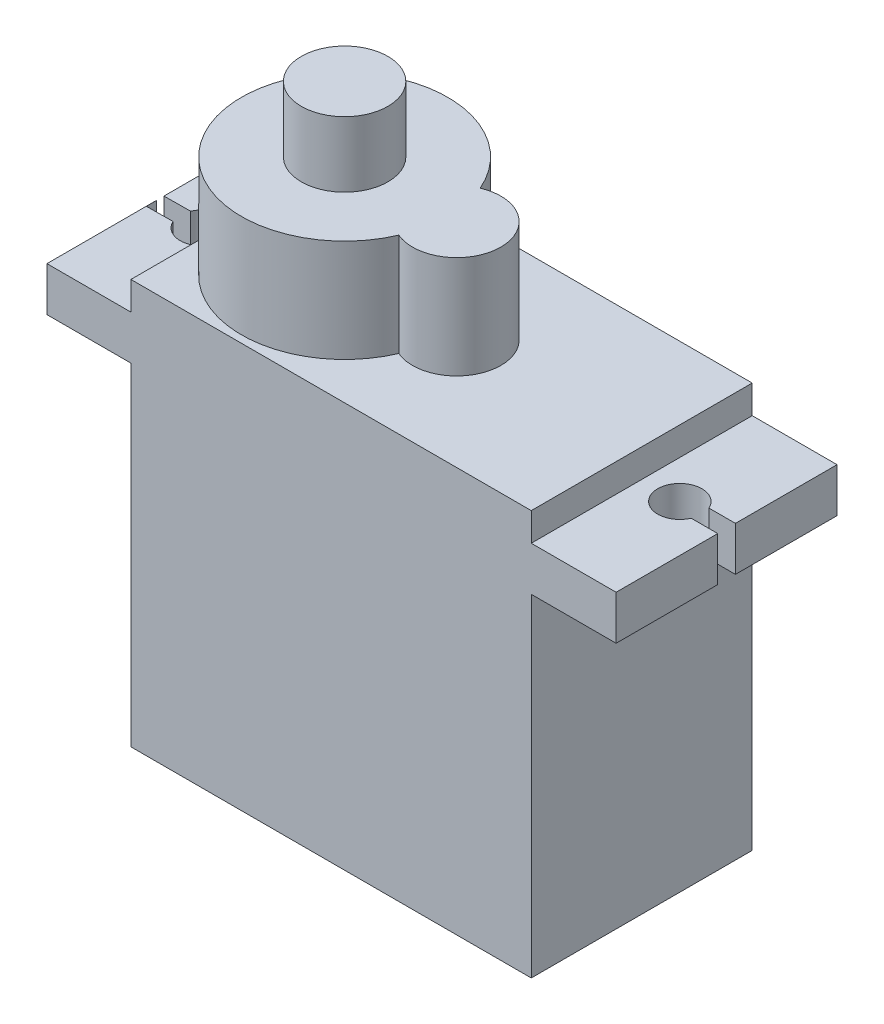
ISO-10303-21;
HEADER;
FILE_DESCRIPTION(('STEP AP214'),'2;1');
FILE_NAME('part.step','',(''),(''),'','','');
FILE_SCHEMA(('AUTOMOTIVE_DESIGN { 1 0 10303 214 1 1 1 1 }'));
ENDSEC;
DATA;
#1=APPLICATION_CONTEXT('core data for automotive mechanical design processes');
#2=APPLICATION_PROTOCOL_DEFINITION('international standard','automotive_design',2000,#1);
#3=PRODUCT_CONTEXT('',#1,'mechanical');
#4=PRODUCT('Part','Part','',(#3));
#5=PRODUCT_RELATED_PRODUCT_CATEGORY('part','',(#4));
#6=PRODUCT_DEFINITION_FORMATION('','',#4);
#7=PRODUCT_DEFINITION_CONTEXT('part definition',#1,'design');
#8=PRODUCT_DEFINITION('design','',#6,#7);
#9=PRODUCT_DEFINITION_SHAPE('','',#8);
#10=(LENGTH_UNIT() NAMED_UNIT(*) SI_UNIT(.MILLI.,.METRE.));
#11=(NAMED_UNIT(*) PLANE_ANGLE_UNIT() SI_UNIT($,.RADIAN.));
#12=(NAMED_UNIT(*) SI_UNIT($,.STERADIAN.) SOLID_ANGLE_UNIT());
#13=UNCERTAINTY_MEASURE_WITH_UNIT(LENGTH_MEASURE(1.E-05),#10,'distance_accuracy_value','');
#14=(GEOMETRIC_REPRESENTATION_CONTEXT(3) GLOBAL_UNCERTAINTY_ASSIGNED_CONTEXT((#13)) GLOBAL_UNIT_ASSIGNED_CONTEXT((#10,
#11,#12)) REPRESENTATION_CONTEXT('',''));
#15=CARTESIAN_POINT('',(0.,0.,0.));
#16=DIRECTION('',(0.,0.,1.));
#17=DIRECTION('',(1.,0.,0.));
#18=AXIS2_PLACEMENT_3D('',#15,#16,#17);
#19=CARTESIAN_POINT('',(-47.695532413833,5.15,2.20686180578577));
#20=DIRECTION('',(1.,0.,0.));
#21=DIRECTION('',(0.,0.,-1.));
#22=AXIS2_PLACEMENT_3D('',#19,#20,#21);
#23=CYLINDRICAL_SURFACE('',#22,0.6);
#24=CARTESIAN_POINT('',(-47.695532413833,5.15,2.20686180578577));
#25=DIRECTION('',(-1.,0.,0.));
#26=DIRECTION('',(0.,0.,1.));
#27=AXIS2_PLACEMENT_3D('',#24,#25,#26);
#28=CIRCLE('',#27,0.6);
#29=CARTESIAN_POINT('',(-47.695532413833,5.15,2.80686180578577));
#30=VERTEX_POINT('',#29);
#31=EDGE_CURVE('E12',#30,#30,#28,.T.);
#32=ORIENTED_EDGE('',*,*,#31,.F.);
#33=EDGE_LOOP('',(#32));
#34=FACE_BOUND('',#33,.T.);
#35=CARTESIAN_POINT('',(-46.195532413833,5.15,2.20686180578577));
#36=DIRECTION('',(-1.,0.,0.));
#37=DIRECTION('',(0.,0.,1.));
#38=AXIS2_PLACEMENT_3D('',#35,#36,#37);
#39=CIRCLE('',#38,0.6);
#40=CARTESIAN_POINT('',(-46.195532413833,5.15,2.80686180578577));
#41=VERTEX_POINT('',#40);
#42=EDGE_CURVE('E55',#41,#41,#39,.T.);
#43=ORIENTED_EDGE('',*,*,#42,.T.);
#44=EDGE_LOOP('',(#43));
#45=FACE_BOUND('',#44,.T.);
#46=ADVANCED_FACE('F52',(#34,#45),#23,.T.);
#47=CARTESIAN_POINT('',(-47.695532413833,0.,0.));
#48=DIRECTION('',(-1.,0.,0.));
#49=DIRECTION('',(0.,0.,1.));
#50=AXIS2_PLACEMENT_3D('',#47,#48,#49);
#51=PLANE('',#50);
#52=ORIENTED_EDGE('',*,*,#31,.T.);
#53=EDGE_LOOP('',(#52));
#54=FACE_BOUND('',#53,.T.);
#55=ADVANCED_FACE('F67',(#54),#51,.T.);
#56=CARTESIAN_POINT('',(-46.195532413833,0.,0.));
#57=DIRECTION('',(-1.,0.,0.));
#58=DIRECTION('',(0.,0.,1.));
#59=AXIS2_PLACEMENT_3D('',#56,#57,#58);
#60=PLANE('',#59);
#61=ORIENTED_EDGE('',*,*,#42,.F.);
#62=EDGE_LOOP('',(#61));
#63=FACE_BOUND('',#62,.T.);
#64=ADVANCED_FACE('F65',(#63),#60,.F.);
#65=CLOSED_SHELL('',(#46,#55,#64));
#66=MANIFOLD_SOLID_BREP('B2',#65);
#67=CARTESIAN_POINT('',(-47.695532413833,5.15,1.00686180578577));
#68=DIRECTION('',(1.,0.,0.));
#69=DIRECTION('',(0.,0.,-1.));
#70=AXIS2_PLACEMENT_3D('',#67,#68,#69);
#71=CYLINDRICAL_SURFACE('',#70,0.6);
#72=CARTESIAN_POINT('',(-47.695532413833,5.15,1.00686180578577));
#73=DIRECTION('',(-1.,0.,0.));
#74=DIRECTION('',(0.,0.,1.));
#75=AXIS2_PLACEMENT_3D('',#72,#73,#74);
#76=CIRCLE('',#75,0.6);
#77=CARTESIAN_POINT('',(-47.695532413833,5.15,1.60686180578577));
#78=VERTEX_POINT('',#77);
#79=EDGE_CURVE('E51',#78,#78,#76,.T.);
#80=ORIENTED_EDGE('',*,*,#79,.F.);
#81=EDGE_LOOP('',(#80));
#82=FACE_BOUND('',#81,.T.);
#83=CARTESIAN_POINT('',(-46.195532413833,5.15,1.00686180578577));
#84=DIRECTION('',(-1.,0.,0.));
#85=DIRECTION('',(0.,0.,1.));
#86=AXIS2_PLACEMENT_3D('',#83,#84,#85);
#87=CIRCLE('',#86,0.6);
#88=CARTESIAN_POINT('',(-46.195532413833,5.15,1.60686180578577));
#89=VERTEX_POINT('',#88);
#90=EDGE_CURVE('E114',#89,#89,#87,.T.);
#91=ORIENTED_EDGE('',*,*,#90,.T.);
#92=EDGE_LOOP('',(#91));
#93=FACE_BOUND('',#92,.T.);
#94=ADVANCED_FACE('F111',(#82,#93),#71,.T.);
#95=CARTESIAN_POINT('',(-47.695532413833,0.,0.));
#96=DIRECTION('',(-1.,0.,0.));
#97=DIRECTION('',(0.,0.,1.));
#98=AXIS2_PLACEMENT_3D('',#95,#96,#97);
#99=PLANE('',#98);
#100=ORIENTED_EDGE('',*,*,#79,.T.);
#101=EDGE_LOOP('',(#100));
#102=FACE_BOUND('',#101,.T.);
#103=ADVANCED_FACE('F126',(#102),#99,.T.);
#104=CARTESIAN_POINT('',(-46.195532413833,0.,0.));
#105=DIRECTION('',(-1.,0.,0.));
#106=DIRECTION('',(0.,0.,1.));
#107=AXIS2_PLACEMENT_3D('',#104,#105,#106);
#108=PLANE('',#107);
#109=ORIENTED_EDGE('',*,*,#90,.F.);
#110=EDGE_LOOP('',(#109));
#111=FACE_BOUND('',#110,.T.);
#112=ADVANCED_FACE('F124',(#111),#108,.F.);
#113=CLOSED_SHELL('',(#94,#103,#112));
#114=MANIFOLD_SOLID_BREP('B7',#113);
#115=CARTESIAN_POINT('',(-47.695532413833,5.15,-0.193138194214225));
#116=DIRECTION('',(1.,0.,0.));
#117=DIRECTION('',(0.,0.,-1.));
#118=AXIS2_PLACEMENT_3D('',#115,#116,#117);
#119=CYLINDRICAL_SURFACE('',#118,0.6);
#120=CARTESIAN_POINT('',(-47.695532413833,5.15,-0.193138194214225));
#121=DIRECTION('',(-1.,0.,0.));
#122=DIRECTION('',(0.,0.,1.));
#123=AXIS2_PLACEMENT_3D('',#120,#121,#122);
#124=CIRCLE('',#123,0.6);
#125=CARTESIAN_POINT('',(-47.695532413833,5.15,0.406861805785774));
#126=VERTEX_POINT('',#125);
#127=EDGE_CURVE('E110',#126,#126,#124,.T.);
#128=ORIENTED_EDGE('',*,*,#127,.F.);
#129=EDGE_LOOP('',(#128));
#130=FACE_BOUND('',#129,.T.);
#131=CARTESIAN_POINT('',(-46.195532413833,5.15,-0.193138194214225));
#132=DIRECTION('',(-1.,0.,0.));
#133=DIRECTION('',(0.,0.,1.));
#134=AXIS2_PLACEMENT_3D('',#131,#132,#133);
#135=CIRCLE('',#134,0.6);
#136=CARTESIAN_POINT('',(-46.195532413833,5.15,0.406861805785774));
#137=VERTEX_POINT('',#136);
#138=EDGE_CURVE('E174',#137,#137,#135,.T.);
#139=ORIENTED_EDGE('',*,*,#138,.T.);
#140=EDGE_LOOP('',(#139));
#141=FACE_BOUND('',#140,.T.);
#142=ADVANCED_FACE('F171',(#130,#141),#119,.T.);
#143=CARTESIAN_POINT('',(-47.695532413833,0.,0.));
#144=DIRECTION('',(-1.,0.,0.));
#145=DIRECTION('',(0.,0.,1.));
#146=AXIS2_PLACEMENT_3D('',#143,#144,#145);
#147=PLANE('',#146);
#148=ORIENTED_EDGE('',*,*,#127,.T.);
#149=EDGE_LOOP('',(#148));
#150=FACE_BOUND('',#149,.T.);
#151=ADVANCED_FACE('F186',(#150),#147,.T.);
#152=CARTESIAN_POINT('',(-46.195532413833,0.,0.));
#153=DIRECTION('',(-1.,0.,0.));
#154=DIRECTION('',(0.,0.,1.));
#155=AXIS2_PLACEMENT_3D('',#152,#153,#154);
#156=PLANE('',#155);
#157=ORIENTED_EDGE('',*,*,#138,.F.);
#158=EDGE_LOOP('',(#157));
#159=FACE_BOUND('',#158,.T.);
#160=ADVANCED_FACE('F184',(#159),#156,.F.);
#161=CLOSED_SHELL('',(#142,#151,#160));
#162=MANIFOLD_SOLID_BREP('B46',#161);
#163=CARTESIAN_POINT('',(-50.945532413833,21.3,7.25686180578577));
#164=DIRECTION('',(0.,1.,0.));
#165=DIRECTION('',(0.,0.,1.));
#166=AXIS2_PLACEMENT_3D('',#163,#164,#165);
#167=PLANE('',#166);
#168=DIRECTION('',(-0.999968000511992,0.,0.00799987200204793));
#169=VECTOR('',#168,1.);
#170=CARTESIAN_POINT('',(-50.990499710868,21.3,1.63603961100693));
#171=LINE('',#170,#169);
#172=CARTESIAN_POINT('',(-49.4410652853071,21.3,1.62364393727167));
#173=VERTEX_POINT('',#172);
#174=CARTESIAN_POINT('',(-50.9410172860751,21.3,1.63564374527474));
#175=VERTEX_POINT('',#174);
#176=EDGE_CURVE('E389',#173,#175,#171,.T.);
#177=ORIENTED_EDGE('',*,*,#176,.T.);
#178=DIRECTION('',(-0.00799987200204854,0.,-0.999968000511992));
#179=VECTOR('',#178,1.);
#180=CARTESIAN_POINT('',(-50.8960499890401,21.3,7.25646594005358));
#181=LINE('',#180,#179);
#182=CARTESIAN_POINT('',(-50.945532413833,21.3,1.07126180578696));
#183=VERTEX_POINT('',#182);
#184=EDGE_CURVE('E413',#175,#183,#181,.T.);
#185=ORIENTED_EDGE('',*,*,#184,.T.);
#186=DIRECTION('',(0.,0.,1.));
#187=VECTOR('',#186,1.);
#188=CARTESIAN_POINT('',(-50.945532413833,21.3,7.25686180578577));
#189=LINE('',#188,#187);
#190=CARTESIAN_POINT('',(-50.945532413833,21.3,7.25686180578577));
#191=VERTEX_POINT('',#190);
#192=EDGE_CURVE('E460',#183,#191,#189,.T.);
#193=ORIENTED_EDGE('',*,*,#192,.T.);
#194=DIRECTION('',(1.,0.,0.));
#195=VECTOR('',#194,1.);
#196=CARTESIAN_POINT('',(-50.945532413833,21.3,7.25686180578577));
#197=LINE('',#196,#195);
#198=CARTESIAN_POINT('',(-46.195532413833,21.3,7.25686180578577));
#199=VERTEX_POINT('',#198);
#200=EDGE_CURVE('E465',#191,#199,#197,.T.);
#201=ORIENTED_EDGE('',*,*,#200,.T.);
#202=DIRECTION('',(0.,0.,1.));
#203=VECTOR('',#202,1.);
#204=CARTESIAN_POINT('',(-46.195532413833,21.3,-5.24313819421423));
#205=LINE('',#204,#203);
#206=CARTESIAN_POINT('',(-46.195532413833,21.3,-5.24313819421423));
#207=VERTEX_POINT('',#206);
#208=EDGE_CURVE('E487',#207,#199,#205,.T.);
#209=ORIENTED_EDGE('',*,*,#208,.F.);
#210=DIRECTION('',(1.,0.,0.));
#211=VECTOR('',#210,1.);
#212=CARTESIAN_POINT('',(-50.945532413833,21.3,-5.24313819421423));
#213=LINE('',#212,#211);
#214=CARTESIAN_POINT('',(-50.945532413833,21.3,-5.24313819421423));
#215=VERTEX_POINT('',#214);
#216=EDGE_CURVE('E469',#215,#207,#213,.T.);
#217=ORIENTED_EDGE('',*,*,#216,.F.);
#218=CARTESIAN_POINT('',(-50.945532413833,21.3,0.635647866362738));
#219=VERTEX_POINT('',#218);
#220=EDGE_CURVE('E461',#215,#219,#189,.T.);
#221=ORIENTED_EDGE('',*,*,#220,.T.);
#222=DIRECTION('',(0.999968000511992,0.,-0.00799987200204735));
#223=VECTOR('',#222,1.);
#224=CARTESIAN_POINT('',(-50.99849958287,21.3,0.63607161049494));
#225=LINE('',#224,#223);
#226=CARTESIAN_POINT('',(-49.4490651573091,21.3,0.623675936759674));
#227=VERTEX_POINT('',#226);
#228=EDGE_CURVE('E237',#219,#227,#225,.T.);
#229=ORIENTED_EDGE('',*,*,#228,.T.);
#230=CARTESIAN_POINT('',(-48.2994579575881,21.3,1.11449493226583));
#231=DIRECTION('',(0.,1.,0.));
#232=DIRECTION('',(0.,0.,1.));
#233=AXIS2_PLACEMENT_3D('',#230,#231,#232);
#234=CIRCLE('',#233,1.25);
#235=EDGE_CURVE('E417',#227,#173,#234,.F.);
#236=ORIENTED_EDGE('',*,*,#235,.T.);
#237=EDGE_LOOP('',(#177,#185,#193,#201,#209,#217,#221,#229,#236));
#238=FACE_BOUND('',#237,.T.);
#239=ADVANCED_FACE('F222',(#238),#167,.T.);
#240=CARTESIAN_POINT('',(-50.945532413833,18.8,7.25686180578577));
#241=DIRECTION('',(0.,-1.,0.));
#242=DIRECTION('',(0.,0.,-1.));
#243=AXIS2_PLACEMENT_3D('',#240,#241,#242);
#244=PLANE('',#243);
#245=DIRECTION('',(0.,0.,-1.));
#246=VECTOR('',#245,1.);
#247=CARTESIAN_POINT('',(-50.945532413833,18.8,7.25686180578577));
#248=LINE('',#247,#246);
#249=CARTESIAN_POINT('',(-50.945532413833,18.8,7.25686180578577));
#250=VERTEX_POINT('',#249);
#251=CARTESIAN_POINT('',(-50.945532413833,18.8,1.07126180578678));
#252=VERTEX_POINT('',#251);
#253=EDGE_CURVE('E455',#250,#252,#248,.T.);
#254=ORIENTED_EDGE('',*,*,#253,.T.);
#255=DIRECTION('',(-0.00799987200204854,0.,-0.999968000511992));
#256=VECTOR('',#255,1.);
#257=CARTESIAN_POINT('',(-50.9490171580771,18.8,0.635675744762745));
#258=LINE('',#257,#256);
#259=CARTESIAN_POINT('',(-50.9410172860751,18.8,1.63564374527474));
#260=VERTEX_POINT('',#259);
#261=EDGE_CURVE('E404',#260,#252,#258,.T.);
#262=ORIENTED_EDGE('',*,*,#261,.F.);
#263=DIRECTION('',(-0.999968000511992,0.,0.00799987200204793));
#264=VECTOR('',#263,1.);
#265=CARTESIAN_POINT('',(-50.9410172860751,18.8,1.63564374527474));
#266=LINE('',#265,#264);
#267=CARTESIAN_POINT('',(-49.4410652853071,18.8,1.62364393727167));
#268=VERTEX_POINT('',#267);
#269=EDGE_CURVE('E386',#268,#260,#266,.T.);
#270=ORIENTED_EDGE('',*,*,#269,.F.);
#271=CARTESIAN_POINT('',(-48.2994579575881,18.8,1.11449493226583));
#272=DIRECTION('',(0.,-1.,0.));
#273=DIRECTION('',(0.,0.,-1.));
#274=AXIS2_PLACEMENT_3D('',#271,#272,#273);
#275=CIRCLE('',#274,1.25);
#276=CARTESIAN_POINT('',(-49.4490651573091,18.8,0.623675936759674));
#277=VERTEX_POINT('',#276);
#278=EDGE_CURVE('E396',#277,#268,#275,.T.);
#279=ORIENTED_EDGE('',*,*,#278,.F.);
#280=DIRECTION('',(0.999968000511992,0.,-0.00799987200204735));
#281=VECTOR('',#280,1.);
#282=CARTESIAN_POINT('',(-50.9490171580771,18.8,0.635675744762745));
#283=LINE('',#282,#281);
#284=CARTESIAN_POINT('',(-50.945532413833,18.8,0.635647866362738));
#285=VERTEX_POINT('',#284);
#286=EDGE_CURVE('E400',#285,#277,#283,.T.);
#287=ORIENTED_EDGE('',*,*,#286,.F.);
#288=CARTESIAN_POINT('',(-50.945532413833,18.8,-5.24313819421423));
#289=VERTEX_POINT('',#288);
#290=EDGE_CURVE('E454',#285,#289,#248,.T.);
#291=ORIENTED_EDGE('',*,*,#290,.T.);
#292=DIRECTION('',(1.,0.,0.));
#293=VECTOR('',#292,1.);
#294=CARTESIAN_POINT('',(-50.945532413833,18.8,-5.24313819421423));
#295=LINE('',#294,#293);
#296=CARTESIAN_POINT('',(-46.195532413833,18.8,-5.24313819421423));
#297=VERTEX_POINT('',#296);
#298=EDGE_CURVE('E473',#289,#297,#295,.T.);
#299=ORIENTED_EDGE('',*,*,#298,.T.);
#300=DIRECTION('',(0.,0.,-1.));
#301=VECTOR('',#300,1.);
#302=CARTESIAN_POINT('',(-46.195532413833,18.8,-5.24313819421423));
#303=LINE('',#302,#301);
#304=CARTESIAN_POINT('',(-46.195532413833,18.8,7.25686180578577));
#305=VERTEX_POINT('',#304);
#306=EDGE_CURVE('E481',#305,#297,#303,.T.);
#307=ORIENTED_EDGE('',*,*,#306,.F.);
#308=DIRECTION('',(1.,0.,0.));
#309=VECTOR('',#308,1.);
#310=CARTESIAN_POINT('',(-50.945532413833,18.8,7.25686180578577));
#311=LINE('',#310,#309);
#312=EDGE_CURVE('E476',#250,#305,#311,.T.);
#313=ORIENTED_EDGE('',*,*,#312,.F.);
#314=EDGE_LOOP('',(#254,#262,#270,#279,#287,#291,#299,#307,#313));
#315=FACE_BOUND('',#314,.T.);
#316=ADVANCED_FACE('F403',(#315),#244,.T.);
#317=CARTESIAN_POINT('',(-50.945532413833,0.,0.));
#318=DIRECTION('',(-1.,0.,0.));
#319=DIRECTION('',(0.,0.,1.));
#320=AXIS2_PLACEMENT_3D('',#317,#318,#319);
#321=PLANE('',#320);
#322=ORIENTED_EDGE('',*,*,#192,.F.);
#323=DIRECTION('',(0.,-1.,0.));
#324=VECTOR('',#323,1.);
#325=CARTESIAN_POINT('',(-50.945532413833,0.,1.07126180578696));
#326=LINE('',#325,#324);
#327=EDGE_CURVE('E169',#183,#252,#326,.T.);
#328=ORIENTED_EDGE('',*,*,#327,.T.);
#329=ORIENTED_EDGE('',*,*,#253,.F.);
#330=DIRECTION('',(0.,-1.,0.));
#331=VECTOR('',#330,1.);
#332=CARTESIAN_POINT('',(-50.945532413833,18.8,7.25686180578577));
#333=LINE('',#332,#331);
#334=EDGE_CURVE('E451',#191,#250,#333,.T.);
#335=ORIENTED_EDGE('',*,*,#334,.F.);
#336=EDGE_LOOP('',(#322,#328,#329,#335));
#337=FACE_BOUND('',#336,.T.);
#338=ADVANCED_FACE('F643',(#337),#321,.T.);
#339=ORIENTED_EDGE('',*,*,#290,.F.);
#340=DIRECTION('',(0.,1.,0.));
#341=VECTOR('',#340,1.);
#342=CARTESIAN_POINT('',(-50.945532413833,0.,0.635647866362738));
#343=LINE('',#342,#341);
#344=EDGE_CURVE('E230',#285,#219,#343,.T.);
#345=ORIENTED_EDGE('',*,*,#344,.T.);
#346=ORIENTED_EDGE('',*,*,#220,.F.);
#347=DIRECTION('',(0.,1.,0.));
#348=VECTOR('',#347,1.);
#349=CARTESIAN_POINT('',(-50.945532413833,18.8,-5.24313819421423));
#350=LINE('',#349,#348);
#351=EDGE_CURVE('E457',#289,#215,#350,.T.);
#352=ORIENTED_EDGE('',*,*,#351,.F.);
#353=EDGE_LOOP('',(#339,#345,#346,#352));
#354=FACE_BOUND('',#353,.T.);
#355=ADVANCED_FACE('F561',(#354),#321,.T.);
#356=CARTESIAN_POINT('',(-18.745532413833,0.,0.));
#357=DIRECTION('',(-1.,0.,0.));
#358=DIRECTION('',(0.,0.,1.));
#359=AXIS2_PLACEMENT_3D('',#356,#357,#358);
#360=PLANE('',#359);
#361=DIRECTION('',(0.,1.,0.));
#362=VECTOR('',#361,1.);
#363=CARTESIAN_POINT('',(-18.745532413833,14.1678771650443,1.50686180578577));
#364=LINE('',#363,#362);
#365=CARTESIAN_POINT('',(-18.745532413833,18.8,1.50686180578577));
#366=VERTEX_POINT('',#365);
#367=CARTESIAN_POINT('',(-18.745532413833,21.3,1.50686180578577));
#368=VERTEX_POINT('',#367);
#369=EDGE_CURVE('E429',#366,#368,#364,.T.);
#370=ORIENTED_EDGE('',*,*,#369,.T.);
#371=DIRECTION('',(0.,0.,1.));
#372=VECTOR('',#371,1.);
#373=CARTESIAN_POINT('',(-18.745532413833,21.3,7.25686180578577));
#374=LINE('',#373,#372);
#375=CARTESIAN_POINT('',(-18.745532413833,21.3,7.25686180578577));
#376=VERTEX_POINT('',#375);
#377=EDGE_CURVE('E447',#368,#376,#374,.T.);
#378=ORIENTED_EDGE('',*,*,#377,.T.);
#379=DIRECTION('',(0.,-1.,0.));
#380=VECTOR('',#379,1.);
#381=CARTESIAN_POINT('',(-18.745532413833,18.8,7.25686180578577));
#382=LINE('',#381,#380);
#383=CARTESIAN_POINT('',(-18.745532413833,18.8,7.25686180578577));
#384=VERTEX_POINT('',#383);
#385=EDGE_CURVE('E422',#376,#384,#382,.T.);
#386=ORIENTED_EDGE('',*,*,#385,.T.);
#387=DIRECTION('',(0.,0.,-1.));
#388=VECTOR('',#387,1.);
#389=CARTESIAN_POINT('',(-18.745532413833,18.8,7.25686180578577));
#390=LINE('',#389,#388);
#391=EDGE_CURVE('E441',#384,#366,#390,.T.);
#392=ORIENTED_EDGE('',*,*,#391,.T.);
#393=EDGE_LOOP('',(#370,#378,#386,#392));
#394=FACE_BOUND('',#393,.T.);
#395=ADVANCED_FACE('F591',(#394),#360,.F.);
#396=DIRECTION('',(0.,1.,0.));
#397=VECTOR('',#396,1.);
#398=CARTESIAN_POINT('',(-18.745532413833,14.1678771650443,0.506861805785774));
#399=LINE('',#398,#397);
#400=CARTESIAN_POINT('',(-18.745532413833,18.8,0.506861805785774));
#401=VERTEX_POINT('',#400);
#402=CARTESIAN_POINT('',(-18.745532413833,21.3,0.506861805785774));
#403=VERTEX_POINT('',#402);
#404=EDGE_CURVE('E245',#401,#403,#399,.T.);
#405=ORIENTED_EDGE('',*,*,#404,.F.);
#406=CARTESIAN_POINT('',(-18.745532413833,18.8,-5.24313819421423));
#407=VERTEX_POINT('',#406);
#408=EDGE_CURVE('E440',#401,#407,#390,.T.);
#409=ORIENTED_EDGE('',*,*,#408,.T.);
#410=DIRECTION('',(0.,1.,0.));
#411=VECTOR('',#410,1.);
#412=CARTESIAN_POINT('',(-18.745532413833,18.8,-5.24313819421423));
#413=LINE('',#412,#411);
#414=CARTESIAN_POINT('',(-18.745532413833,21.3,-5.24313819421423));
#415=VERTEX_POINT('',#414);
#416=EDGE_CURVE('E444',#407,#415,#413,.T.);
#417=ORIENTED_EDGE('',*,*,#416,.T.);
#418=EDGE_CURVE('E448',#415,#403,#374,.T.);
#419=ORIENTED_EDGE('',*,*,#418,.T.);
#420=EDGE_LOOP('',(#405,#409,#417,#419));
#421=FACE_BOUND('',#420,.T.);
#422=ADVANCED_FACE('F617',(#421),#360,.F.);
#423=CARTESIAN_POINT('',(-21.391176337572,18.8,1.00686180578577));
#424=DIRECTION('',(0.,-1.,0.));
#425=DIRECTION('',(0.,0.,-1.));
#426=AXIS2_PLACEMENT_3D('',#423,#424,#425);
#427=CIRCLE('',#426,1.25);
#428=CARTESIAN_POINT('',(-20.245532413833,18.8,1.50686180578577));
#429=VERTEX_POINT('',#428);
#430=CARTESIAN_POINT('',(-20.245532413833,18.8,0.506861805785775));
#431=VERTEX_POINT('',#430);
#432=EDGE_CURVE('E419',#429,#431,#427,.T.);
#433=ORIENTED_EDGE('',*,*,#432,.F.);
#434=DIRECTION('',(-1.,0.,0.));
#435=VECTOR('',#434,1.);
#436=CARTESIAN_POINT('',(-18.745532413833,18.8,1.50686180578577));
#437=LINE('',#436,#435);
#438=EDGE_CURVE('E423',#366,#429,#437,.T.);
#439=ORIENTED_EDGE('',*,*,#438,.F.);
#440=ORIENTED_EDGE('',*,*,#391,.F.);
#441=CARTESIAN_POINT('',(-23.545532413833,18.8,7.25686180578577));
#442=VERTEX_POINT('',#441);
#443=EDGE_CURVE('E464',#442,#384,#311,.T.);
#444=ORIENTED_EDGE('',*,*,#443,.F.);
#445=DIRECTION('',(0.,0.,1.));
#446=VECTOR('',#445,1.);
#447=CARTESIAN_POINT('',(-23.545532413833,18.8,-5.24313819421423));
#448=LINE('',#447,#446);
#449=CARTESIAN_POINT('',(-23.545532413833,18.8,-5.24313819421423));
#450=VERTEX_POINT('',#449);
#451=EDGE_CURVE('E467',#450,#442,#448,.T.);
#452=ORIENTED_EDGE('',*,*,#451,.F.);
#453=EDGE_CURVE('E475',#450,#407,#295,.T.);
#454=ORIENTED_EDGE('',*,*,#453,.T.);
#455=ORIENTED_EDGE('',*,*,#408,.F.);
#456=DIRECTION('',(1.,0.,0.));
#457=VECTOR('',#456,1.);
#458=CARTESIAN_POINT('',(-18.745532413833,18.8,0.506861805785774));
#459=LINE('',#458,#457);
#460=EDGE_CURVE('E426',#431,#401,#459,.T.);
#461=ORIENTED_EDGE('',*,*,#460,.F.);
#462=EDGE_LOOP('',(#433,#439,#440,#444,#452,#454,#455,#461));
#463=FACE_BOUND('',#462,.T.);
#464=ADVANCED_FACE('F589',(#463),#244,.T.);
#465=ORIENTED_EDGE('',*,*,#377,.F.);
#466=DIRECTION('',(-1.,0.,0.));
#467=VECTOR('',#466,1.);
#468=CARTESIAN_POINT('',(-50.945532413833,21.3,1.50686180578576));
#469=LINE('',#468,#467);
#470=CARTESIAN_POINT('',(-20.245532413833,21.3,1.50686180578577));
#471=VERTEX_POINT('',#470);
#472=EDGE_CURVE('E556',#368,#471,#469,.T.);
#473=ORIENTED_EDGE('',*,*,#472,.T.);
#474=CARTESIAN_POINT('',(-21.391176337572,21.3,1.00686180578577));
#475=DIRECTION('',(0.,1.,0.));
#476=DIRECTION('',(0.,0.,1.));
#477=AXIS2_PLACEMENT_3D('',#474,#475,#476);
#478=CIRCLE('',#477,1.25);
#479=CARTESIAN_POINT('',(-20.245532413833,21.3,0.506861805785775));
#480=VERTEX_POINT('',#479);
#481=EDGE_CURVE('E553',#471,#480,#478,.F.);
#482=ORIENTED_EDGE('',*,*,#481,.T.);
#483=DIRECTION('',(1.,0.,0.));
#484=VECTOR('',#483,1.);
#485=CARTESIAN_POINT('',(-50.945532413833,21.3,0.506861805785792));
#486=LINE('',#485,#484);
#487=EDGE_CURVE('E551',#480,#403,#486,.T.);
#488=ORIENTED_EDGE('',*,*,#487,.T.);
#489=ORIENTED_EDGE('',*,*,#418,.F.);
#490=CARTESIAN_POINT('',(-23.545532413833,21.3,-5.24313819421423));
#491=VERTEX_POINT('',#490);
#492=EDGE_CURVE('E472',#491,#415,#213,.T.);
#493=ORIENTED_EDGE('',*,*,#492,.F.);
#494=DIRECTION('',(0.,0.,-1.));
#495=VECTOR('',#494,1.);
#496=CARTESIAN_POINT('',(-23.545532413833,21.3,-5.24313819421423));
#497=LINE('',#496,#495);
#498=CARTESIAN_POINT('',(-23.545532413833,21.3,7.25686180578577));
#499=VERTEX_POINT('',#498);
#500=EDGE_CURVE('E484',#499,#491,#497,.T.);
#501=ORIENTED_EDGE('',*,*,#500,.F.);
#502=EDGE_CURVE('E468',#499,#376,#197,.T.);
#503=ORIENTED_EDGE('',*,*,#502,.T.);
#504=EDGE_LOOP('',(#465,#473,#482,#488,#489,#493,#501,#503));
#505=FACE_BOUND('',#504,.T.);
#506=ADVANCED_FACE('F595',(#505),#167,.T.);
#507=CARTESIAN_POINT('',(-46.195532413833,22.9,-5.24313819421423));
#508=DIRECTION('',(1.,0.,0.));
#509=DIRECTION('',(0.,0.,-1.));
#510=AXIS2_PLACEMENT_3D('',#507,#508,#509);
#511=PLANE('',#510);
#512=DIRECTION('',(0.,-1.,0.));
#513=VECTOR('',#512,1.);
#514=CARTESIAN_POINT('',(-46.195532413833,22.9,-5.24313819421423));
#515=LINE('',#514,#513);
#516=CARTESIAN_POINT('',(-46.195532413833,22.9,-5.24313819421423));
#517=VERTEX_POINT('',#516);
#518=EDGE_CURVE('E536',#517,#207,#515,.T.);
#519=ORIENTED_EDGE('',*,*,#518,.T.);
#520=ORIENTED_EDGE('',*,*,#208,.T.);
#521=DIRECTION('',(0.,-1.,0.));
#522=VECTOR('',#521,1.);
#523=CARTESIAN_POINT('',(-46.195532413833,22.9,7.25686180578577));
#524=LINE('',#523,#522);
#525=CARTESIAN_POINT('',(-46.195532413833,22.9,7.25686180578577));
#526=VERTEX_POINT('',#525);
#527=EDGE_CURVE('E548',#526,#199,#524,.T.);
#528=ORIENTED_EDGE('',*,*,#527,.F.);
#529=DIRECTION('',(0.,0.,1.));
#530=VECTOR('',#529,1.);
#531=CARTESIAN_POINT('',(-46.195532413833,22.9,-5.24313819421423));
#532=LINE('',#531,#530);
#533=CARTESIAN_POINT('',(-46.195532413833,22.9,1.00686180578577));
#534=VERTEX_POINT('',#533);
#535=EDGE_CURVE('E518',#534,#526,#532,.T.);
#536=ORIENTED_EDGE('',*,*,#535,.F.);
#537=EDGE_CURVE('E514',#517,#534,#532,.T.);
#538=ORIENTED_EDGE('',*,*,#537,.F.);
#539=EDGE_LOOP('',(#519,#520,#528,#536,#538));
#540=FACE_BOUND('',#539,.T.);
#541=ADVANCED_FACE('F611',(#540),#511,.F.);
#542=CARTESIAN_POINT('',(-23.545532413833,22.9,-5.24313819421423));
#543=DIRECTION('',(-1.,0.,0.));
#544=DIRECTION('',(0.,0.,1.));
#545=AXIS2_PLACEMENT_3D('',#542,#543,#544);
#546=PLANE('',#545);
#547=DIRECTION('',(0.,-1.,0.));
#548=VECTOR('',#547,1.);
#549=CARTESIAN_POINT('',(-23.545532413833,22.9,7.25686180578577));
#550=LINE('',#549,#548);
#551=CARTESIAN_POINT('',(-23.545532413833,22.9,7.25686180578577));
#552=VERTEX_POINT('',#551);
#553=EDGE_CURVE('E544',#552,#499,#550,.T.);
#554=ORIENTED_EDGE('',*,*,#553,.T.);
#555=ORIENTED_EDGE('',*,*,#500,.T.);
#556=DIRECTION('',(0.,-1.,0.));
#557=VECTOR('',#556,1.);
#558=CARTESIAN_POINT('',(-23.545532413833,22.9,-5.24313819421423));
#559=LINE('',#558,#557);
#560=CARTESIAN_POINT('',(-23.545532413833,22.9,-5.24313819421423));
#561=VERTEX_POINT('',#560);
#562=EDGE_CURVE('E540',#561,#491,#559,.T.);
#563=ORIENTED_EDGE('',*,*,#562,.F.);
#564=DIRECTION('',(0.,0.,-1.));
#565=VECTOR('',#564,1.);
#566=CARTESIAN_POINT('',(-23.545532413833,22.9,-5.24313819421423));
#567=LINE('',#566,#565);
#568=EDGE_CURVE('E520',#552,#561,#567,.T.);
#569=ORIENTED_EDGE('',*,*,#568,.F.);
#570=EDGE_LOOP('',(#554,#555,#563,#569));
#571=FACE_BOUND('',#570,.T.);
#572=ADVANCED_FACE('F600',(#571),#546,.F.);
#573=CARTESIAN_POINT('',(-46.195532413833,22.9,7.25686180578577));
#574=DIRECTION('',(0.,1.,0.));
#575=DIRECTION('',(0.,0.,1.));
#576=AXIS2_PLACEMENT_3D('',#573,#574,#575);
#577=PLANE('',#576);
#578=CARTESIAN_POINT('',(-40.355532413833,22.9,1.00686180578577));
#579=DIRECTION('',(0.,1.,0.));
#580=DIRECTION('',(0.,0.,1.));
#581=AXIS2_PLACEMENT_3D('',#578,#579,#580);
#582=CIRCLE('',#581,5.84);
#583=CARTESIAN_POINT('',(-34.9887185337068,22.9,-1.29594273999855));
#584=VERTEX_POINT('',#583);
#585=EDGE_CURVE('E504',#584,#534,#582,.T.);
#586=ORIENTED_EDGE('',*,*,#585,.F.);
#587=CARTESIAN_POINT('',(-34.015532413833,22.9,1.00686180578577));
#588=DIRECTION('',(0.,1.,0.));
#589=DIRECTION('',(0.,0.,1.));
#590=AXIS2_PLACEMENT_3D('',#587,#588,#589);
#591=CIRCLE('',#590,2.5);
#592=CARTESIAN_POINT('',(-34.9887185337068,22.9,3.3096663515701));
#593=VERTEX_POINT('',#592);
#594=EDGE_CURVE('E490',#593,#584,#591,.T.);
#595=ORIENTED_EDGE('',*,*,#594,.F.);
#596=EDGE_CURVE('E511',#534,#593,#582,.T.);
#597=ORIENTED_EDGE('',*,*,#596,.F.);
#598=ORIENTED_EDGE('',*,*,#535,.T.);
#599=DIRECTION('',(1.,0.,0.));
#600=VECTOR('',#599,1.);
#601=CARTESIAN_POINT('',(-46.195532413833,22.9,7.25686180578577));
#602=LINE('',#601,#600);
#603=EDGE_CURVE('E517',#526,#552,#602,.T.);
#604=ORIENTED_EDGE('',*,*,#603,.T.);
#605=ORIENTED_EDGE('',*,*,#568,.T.);
#606=DIRECTION('',(-1.,0.,0.));
#607=VECTOR('',#606,1.);
#608=CARTESIAN_POINT('',(-46.195532413833,22.9,-5.24313819421423));
#609=LINE('',#608,#607);
#610=EDGE_CURVE('E522',#561,#517,#609,.T.);
#611=ORIENTED_EDGE('',*,*,#610,.T.);
#612=ORIENTED_EDGE('',*,*,#537,.T.);
#613=EDGE_LOOP('',(#586,#595,#597,#598,#604,#605,#611,#612));
#614=FACE_BOUND('',#613,.T.);
#615=ADVANCED_FACE('F605',(#614),#577,.T.);
#616=CARTESIAN_POINT('',(-40.355532413833,28.7,1.00686180578577));
#617=DIRECTION('',(0.,-1.,0.));
#618=DIRECTION('',(0.,0.,-1.));
#619=AXIS2_PLACEMENT_3D('',#616,#617,#618);
#620=CYLINDRICAL_SURFACE('',#619,5.84);
#621=DIRECTION('',(0.,-1.,0.));
#622=VECTOR('',#621,1.);
#623=CARTESIAN_POINT('',(-34.9887185337068,28.7,3.3096663515701));
#624=LINE('',#623,#622);
#625=CARTESIAN_POINT('',(-34.9887185337068,28.7,3.3096663515701));
#626=VERTEX_POINT('',#625);
#627=EDGE_CURVE('E498',#626,#593,#624,.T.);
#628=ORIENTED_EDGE('',*,*,#627,.F.);
#629=CARTESIAN_POINT('',(-40.355532413833,28.7,1.00686180578577));
#630=DIRECTION('',(0.,1.,0.));
#631=DIRECTION('',(0.,0.,1.));
#632=AXIS2_PLACEMENT_3D('',#629,#630,#631);
#633=CIRCLE('',#632,5.84);
#634=CARTESIAN_POINT('',(-34.9887185337068,28.7,-1.29594273999856));
#635=VERTEX_POINT('',#634);
#636=EDGE_CURVE('E507',#635,#626,#633,.T.);
#637=ORIENTED_EDGE('',*,*,#636,.F.);
#638=DIRECTION('',(0.,-1.,0.));
#639=VECTOR('',#638,1.);
#640=CARTESIAN_POINT('',(-34.9887185337068,28.7,-1.29594273999855));
#641=LINE('',#640,#639);
#642=EDGE_CURVE('E494',#635,#584,#641,.T.);
#643=ORIENTED_EDGE('',*,*,#642,.T.);
#644=ORIENTED_EDGE('',*,*,#585,.T.);
#645=ORIENTED_EDGE('',*,*,#596,.T.);
#646=EDGE_LOOP('',(#628,#637,#643,#644,#645));
#647=FACE_BOUND('',#646,.T.);
#648=ADVANCED_FACE('F665',(#647),#620,.T.);
#649=CARTESIAN_POINT('',(0.,28.7,0.));
#650=DIRECTION('',(0.,1.,0.));
#651=DIRECTION('',(0.,0.,1.));
#652=AXIS2_PLACEMENT_3D('',#649,#650,#651);
#653=PLANE('',#652);
#654=ORIENTED_EDGE('',*,*,#636,.T.);
#655=CARTESIAN_POINT('',(-34.015532413833,28.7,1.00686180578577));
#656=DIRECTION('',(0.,1.,0.));
#657=DIRECTION('',(0.,0.,1.));
#658=AXIS2_PLACEMENT_3D('',#655,#656,#657);
#659=CIRCLE('',#658,2.5);
#660=EDGE_CURVE('E491',#626,#635,#659,.T.);
#661=ORIENTED_EDGE('',*,*,#660,.T.);
#662=EDGE_LOOP('',(#654,#661));
#663=FACE_BOUND('',#662,.T.);
#664=CARTESIAN_POINT('',(-40.355532413833,28.7,1.00686180578577));
#665=DIRECTION('',(0.,1.,0.));
#666=DIRECTION('',(0.,0.,1.));
#667=AXIS2_PLACEMENT_3D('',#664,#665,#666);
#668=CIRCLE('',#667,2.45);
#669=CARTESIAN_POINT('',(-40.355532413833,28.7,3.45686180578577));
#670=VERTEX_POINT('',#669);
#671=EDGE_CURVE('E500',#670,#670,#668,.T.);
#672=ORIENTED_EDGE('',*,*,#671,.F.);
#673=EDGE_LOOP('',(#672));
#674=FACE_BOUND('',#673,.T.);
#675=ADVANCED_FACE('F662',(#663,#674),#653,.T.);
#676=CARTESIAN_POINT('',(-46.195532413833,0.,7.25686180578577));
#677=VERTEX_POINT('',#676);
#678=EDGE_CURVE('E547',#305,#677,#524,.T.);
#679=ORIENTED_EDGE('',*,*,#678,.F.);
#680=ORIENTED_EDGE('',*,*,#306,.T.);
#681=CARTESIAN_POINT('',(-46.195532413833,0.,-5.24313819421423));
#682=VERTEX_POINT('',#681);
#683=EDGE_CURVE('E524',#297,#682,#515,.T.);
#684=ORIENTED_EDGE('',*,*,#683,.T.);
#685=DIRECTION('',(0.,0.,1.));
#686=VECTOR('',#685,1.);
#687=CARTESIAN_POINT('',(-46.195532413833,0.,-5.24313819421423));
#688=LINE('',#687,#686);
#689=EDGE_CURVE('E510',#682,#677,#688,.T.);
#690=ORIENTED_EDGE('',*,*,#689,.T.);
#691=EDGE_LOOP('',(#679,#680,#684,#690));
#692=FACE_BOUND('',#691,.T.);
#693=ADVANCED_FACE('F224',(#692),#511,.F.);
#694=CARTESIAN_POINT('',(-46.195532413833,22.9,7.25686180578577));
#695=DIRECTION('',(0.,0.,-1.));
#696=DIRECTION('',(-1.,0.,0.));
#697=AXIS2_PLACEMENT_3D('',#694,#695,#696);
#698=PLANE('',#697);
#699=CARTESIAN_POINT('',(-23.545532413833,0.,7.25686180578577));
#700=VERTEX_POINT('',#699);
#701=EDGE_CURVE('E543',#442,#700,#550,.T.);
#702=ORIENTED_EDGE('',*,*,#701,.F.);
#703=ORIENTED_EDGE('',*,*,#443,.T.);
#704=ORIENTED_EDGE('',*,*,#385,.F.);
#705=ORIENTED_EDGE('',*,*,#502,.F.);
#706=ORIENTED_EDGE('',*,*,#553,.F.);
#707=ORIENTED_EDGE('',*,*,#603,.F.);
#708=ORIENTED_EDGE('',*,*,#527,.T.);
#709=ORIENTED_EDGE('',*,*,#200,.F.);
#710=ORIENTED_EDGE('',*,*,#334,.T.);
#711=ORIENTED_EDGE('',*,*,#312,.T.);
#712=ORIENTED_EDGE('',*,*,#678,.T.);
#713=DIRECTION('',(1.,0.,0.));
#714=VECTOR('',#713,1.);
#715=CARTESIAN_POINT('',(-46.195532413833,0.,7.25686180578577));
#716=LINE('',#715,#714);
#717=EDGE_CURVE('E527',#677,#700,#716,.T.);
#718=ORIENTED_EDGE('',*,*,#717,.T.);
#719=EDGE_LOOP('',(#702,#703,#704,#705,#706,#707,#708,#709,#710,#711,#712,#718));
#720=FACE_BOUND('',#719,.T.);
#721=ADVANCED_FACE('F575',(#720),#698,.F.);
#722=CARTESIAN_POINT('',(-23.545532413833,0.,-5.24313819421423));
#723=VERTEX_POINT('',#722);
#724=EDGE_CURVE('E539',#450,#723,#559,.T.);
#725=ORIENTED_EDGE('',*,*,#724,.F.);
#726=ORIENTED_EDGE('',*,*,#451,.T.);
#727=ORIENTED_EDGE('',*,*,#701,.T.);
#728=DIRECTION('',(0.,0.,-1.));
#729=VECTOR('',#728,1.);
#730=CARTESIAN_POINT('',(-23.545532413833,0.,-5.24313819421423));
#731=LINE('',#730,#729);
#732=EDGE_CURVE('E530',#700,#723,#731,.T.);
#733=ORIENTED_EDGE('',*,*,#732,.T.);
#734=EDGE_LOOP('',(#725,#726,#727,#733));
#735=FACE_BOUND('',#734,.T.);
#736=ADVANCED_FACE('F582',(#735),#546,.F.);
#737=CARTESIAN_POINT('',(-46.195532413833,22.9,-5.24313819421423));
#738=DIRECTION('',(0.,0.,1.));
#739=DIRECTION('',(1.,0.,0.));
#740=AXIS2_PLACEMENT_3D('',#737,#738,#739);
#741=PLANE('',#740);
#742=ORIENTED_EDGE('',*,*,#683,.F.);
#743=ORIENTED_EDGE('',*,*,#298,.F.);
#744=ORIENTED_EDGE('',*,*,#351,.T.);
#745=ORIENTED_EDGE('',*,*,#216,.T.);
#746=ORIENTED_EDGE('',*,*,#518,.F.);
#747=ORIENTED_EDGE('',*,*,#610,.F.);
#748=ORIENTED_EDGE('',*,*,#562,.T.);
#749=ORIENTED_EDGE('',*,*,#492,.T.);
#750=ORIENTED_EDGE('',*,*,#416,.F.);
#751=ORIENTED_EDGE('',*,*,#453,.F.);
#752=ORIENTED_EDGE('',*,*,#724,.T.);
#753=DIRECTION('',(-1.,0.,0.));
#754=VECTOR('',#753,1.);
#755=CARTESIAN_POINT('',(-46.195532413833,0.,-5.24313819421423));
#756=LINE('',#755,#754);
#757=EDGE_CURVE('E533',#723,#682,#756,.T.);
#758=ORIENTED_EDGE('',*,*,#757,.T.);
#759=EDGE_LOOP('',(#742,#743,#744,#745,#746,#747,#748,#749,#750,#751,#752,#758));
#760=FACE_BOUND('',#759,.T.);
#761=ADVANCED_FACE('F568',(#760),#741,.F.);
#762=CARTESIAN_POINT('',(-46.195532413833,0.,7.25686180578577));
#763=DIRECTION('',(0.,1.,0.));
#764=DIRECTION('',(0.,0.,1.));
#765=AXIS2_PLACEMENT_3D('',#762,#763,#764);
#766=PLANE('',#765);
#767=ORIENTED_EDGE('',*,*,#689,.F.);
#768=ORIENTED_EDGE('',*,*,#757,.F.);
#769=ORIENTED_EDGE('',*,*,#732,.F.);
#770=ORIENTED_EDGE('',*,*,#717,.F.);
#771=EDGE_LOOP('',(#767,#768,#769,#770));
#772=FACE_BOUND('',#771,.T.);
#773=ADVANCED_FACE('F578',(#772),#766,.F.);
#774=CARTESIAN_POINT('',(-40.355532413833,32.4,1.00686180578577));
#775=DIRECTION('',(0.,-1.,0.));
#776=DIRECTION('',(0.,0.,-1.));
#777=AXIS2_PLACEMENT_3D('',#774,#775,#776);
#778=CYLINDRICAL_SURFACE('',#777,2.45);
#779=CARTESIAN_POINT('',(-40.355532413833,32.4,1.00686180578577));
#780=DIRECTION('',(0.,1.,0.));
#781=DIRECTION('',(0.,0.,1.));
#782=AXIS2_PLACEMENT_3D('',#779,#780,#781);
#783=CIRCLE('',#782,2.45);
#784=CARTESIAN_POINT('',(-40.355532413833,32.4,3.45686180578577));
#785=VERTEX_POINT('',#784);
#786=EDGE_CURVE('E501',#785,#785,#783,.T.);
#787=ORIENTED_EDGE('',*,*,#786,.F.);
#788=EDGE_LOOP('',(#787));
#789=FACE_BOUND('',#788,.T.);
#790=ORIENTED_EDGE('',*,*,#671,.T.);
#791=EDGE_LOOP('',(#790));
#792=FACE_BOUND('',#791,.T.);
#793=ADVANCED_FACE('F657',(#789,#792),#778,.T.);
#794=CARTESIAN_POINT('',(-40.355532413833,32.4,1.00686180578577));
#795=DIRECTION('',(0.,1.,0.));
#796=DIRECTION('',(0.,0.,1.));
#797=AXIS2_PLACEMENT_3D('',#794,#795,#796);
#798=PLANE('',#797);
#799=ORIENTED_EDGE('',*,*,#786,.T.);
#800=EDGE_LOOP('',(#799));
#801=FACE_BOUND('',#800,.T.);
#802=ADVANCED_FACE('F634',(#801),#798,.T.);
#803=CARTESIAN_POINT('',(-34.015532413833,28.7,1.00686180578577));
#804=DIRECTION('',(0.,-1.,0.));
#805=DIRECTION('',(0.,0.,-1.));
#806=AXIS2_PLACEMENT_3D('',#803,#804,#805);
#807=CYLINDRICAL_SURFACE('',#806,2.5);
#808=ORIENTED_EDGE('',*,*,#594,.T.);
#809=ORIENTED_EDGE('',*,*,#642,.F.);
#810=ORIENTED_EDGE('',*,*,#660,.F.);
#811=ORIENTED_EDGE('',*,*,#627,.T.);
#812=EDGE_LOOP('',(#808,#809,#810,#811));
#813=FACE_BOUND('',#812,.T.);
#814=ADVANCED_FACE('F627',(#813),#807,.T.);
#815=CARTESIAN_POINT('',(-18.745532413833,14.1678771650443,1.50686180578577));
#816=DIRECTION('',(0.,0.,-1.));
#817=DIRECTION('',(-1.,0.,0.));
#818=AXIS2_PLACEMENT_3D('',#815,#816,#817);
#819=PLANE('',#818);
#820=ORIENTED_EDGE('',*,*,#369,.F.);
#821=ORIENTED_EDGE('',*,*,#438,.T.);
#822=DIRECTION('',(0.,1.,0.));
#823=VECTOR('',#822,1.);
#824=CARTESIAN_POINT('',(-20.245532413833,14.1678771650443,1.50686180578577));
#825=LINE('',#824,#823);
#826=EDGE_CURVE('E432',#429,#471,#825,.T.);
#827=ORIENTED_EDGE('',*,*,#826,.T.);
#828=ORIENTED_EDGE('',*,*,#472,.F.);
#829=EDGE_LOOP('',(#820,#821,#827,#828));
#830=FACE_BOUND('',#829,.T.);
#831=ADVANCED_FACE('F625',(#830),#819,.T.);
#832=CARTESIAN_POINT('',(-21.391176337572,14.1678771650443,1.00686180578577));
#833=DIRECTION('',(0.,1.,0.));
#834=DIRECTION('',(0.,0.,1.));
#835=AXIS2_PLACEMENT_3D('',#832,#833,#834);
#836=CYLINDRICAL_SURFACE('',#835,1.25);
#837=ORIENTED_EDGE('',*,*,#826,.F.);
#838=ORIENTED_EDGE('',*,*,#432,.T.);
#839=DIRECTION('',(0.,1.,0.));
#840=VECTOR('',#839,1.);
#841=CARTESIAN_POINT('',(-20.245532413833,14.1678771650443,0.506861805785775));
#842=LINE('',#841,#840);
#843=EDGE_CURVE('E428',#431,#480,#842,.T.);
#844=ORIENTED_EDGE('',*,*,#843,.T.);
#845=ORIENTED_EDGE('',*,*,#481,.F.);
#846=EDGE_LOOP('',(#837,#838,#844,#845));
#847=FACE_BOUND('',#846,.T.);
#848=ADVANCED_FACE('F622',(#847),#836,.F.);
#849=CARTESIAN_POINT('',(-18.745532413833,14.1678771650443,0.506861805785774));
#850=DIRECTION('',(0.,0.,1.));
#851=DIRECTION('',(1.,0.,0.));
#852=AXIS2_PLACEMENT_3D('',#849,#850,#851);
#853=PLANE('',#852);
#854=ORIENTED_EDGE('',*,*,#843,.F.);
#855=ORIENTED_EDGE('',*,*,#460,.T.);
#856=ORIENTED_EDGE('',*,*,#404,.T.);
#857=ORIENTED_EDGE('',*,*,#487,.F.);
#858=EDGE_LOOP('',(#854,#855,#856,#857));
#859=FACE_BOUND('',#858,.T.);
#860=ADVANCED_FACE('F620',(#859),#853,.T.);
#861=CARTESIAN_POINT('',(-50.9490171580771,14.1678771650443,0.635675744762745));
#862=DIRECTION('',(0.999968000511992,0.,-0.00799987200204854));
#863=DIRECTION('',(-0.00799987200204854,0.,-0.999968000511992));
#864=AXIS2_PLACEMENT_3D('',#861,#862,#863);
#865=PLANE('',#864);
#866=DIRECTION('',(0.,1.,0.));
#867=VECTOR('',#866,1.);
#868=CARTESIAN_POINT('',(-50.9410172860751,14.1678771650443,1.63564374527474));
#869=LINE('',#868,#867);
#870=EDGE_CURVE('E409',#260,#175,#869,.T.);
#871=ORIENTED_EDGE('',*,*,#870,.F.);
#872=ORIENTED_EDGE('',*,*,#261,.T.);
#873=ORIENTED_EDGE('',*,*,#327,.F.);
#874=ORIENTED_EDGE('',*,*,#184,.F.);
#875=EDGE_LOOP('',(#871,#872,#873,#874));
#876=FACE_BOUND('',#875,.T.);
#877=ADVANCED_FACE('F823',(#876),#865,.T.);
#878=CARTESIAN_POINT('',(-50.9490171580771,14.1678771650443,0.635675744762745));
#879=DIRECTION('',(0.00799987200204735,0.,0.999968000511992));
#880=DIRECTION('',(0.999968000511992,0.,-0.00799987200204735));
#881=AXIS2_PLACEMENT_3D('',#878,#879,#880);
#882=PLANE('',#881);
#883=ORIENTED_EDGE('',*,*,#344,.F.);
#884=ORIENTED_EDGE('',*,*,#286,.T.);
#885=DIRECTION('',(0.,1.,0.));
#886=VECTOR('',#885,1.);
#887=CARTESIAN_POINT('',(-49.4490651573091,14.1678771650443,0.623675936759674));
#888=LINE('',#887,#886);
#889=EDGE_CURVE('E392',#277,#227,#888,.T.);
#890=ORIENTED_EDGE('',*,*,#889,.T.);
#891=ORIENTED_EDGE('',*,*,#228,.F.);
#892=EDGE_LOOP('',(#883,#884,#890,#891));
#893=FACE_BOUND('',#892,.T.);
#894=ADVANCED_FACE('F832',(#893),#882,.T.);
#895=CARTESIAN_POINT('',(-48.2994579575881,14.1678771650443,1.11449493226583));
#896=DIRECTION('',(0.,1.,0.));
#897=DIRECTION('',(0.,0.,1.));
#898=AXIS2_PLACEMENT_3D('',#895,#896,#897);
#899=CYLINDRICAL_SURFACE('',#898,1.25);
#900=ORIENTED_EDGE('',*,*,#889,.F.);
#901=ORIENTED_EDGE('',*,*,#278,.T.);
#902=DIRECTION('',(0.,1.,0.));
#903=VECTOR('',#902,1.);
#904=CARTESIAN_POINT('',(-49.4410652853071,14.1678771650443,1.62364393727167));
#905=LINE('',#904,#903);
#906=EDGE_CURVE('E381',#268,#173,#905,.T.);
#907=ORIENTED_EDGE('',*,*,#906,.T.);
#908=ORIENTED_EDGE('',*,*,#235,.F.);
#909=EDGE_LOOP('',(#900,#901,#907,#908));
#910=FACE_BOUND('',#909,.T.);
#911=ADVANCED_FACE('F397',(#910),#899,.F.);
#912=CARTESIAN_POINT('',(-50.9410172860751,14.1678771650443,1.63564374527474));
#913=DIRECTION('',(-0.00799987200204793,0.,-0.999968000511992));
#914=DIRECTION('',(-0.999968000511992,0.,0.00799987200204793));
#915=AXIS2_PLACEMENT_3D('',#912,#913,#914);
#916=PLANE('',#915);
#917=ORIENTED_EDGE('',*,*,#906,.F.);
#918=ORIENTED_EDGE('',*,*,#269,.T.);
#919=ORIENTED_EDGE('',*,*,#870,.T.);
#920=ORIENTED_EDGE('',*,*,#176,.F.);
#921=EDGE_LOOP('',(#917,#918,#919,#920));
#922=FACE_BOUND('',#921,.T.);
#923=ADVANCED_FACE('F383',(#922),#916,.T.);
#924=CLOSED_SHELL('',(#239,#316,#338,#355,#395,#422,#464,#506,#541,#572,#615,#648,#675,#693,
#721,#736,#761,#773,#793,#802,#814,#831,#848,#860,#877,#894,#911,#923));
#925=MANIFOLD_SOLID_BREP('B105',#924);
#926=ADVANCED_BREP_SHAPE_REPRESENTATION('',(#18,#66,#114,#162,#925),#14);
#927=SHAPE_DEFINITION_REPRESENTATION(#9,#926);
ENDSEC;
END-ISO-10303-21;
